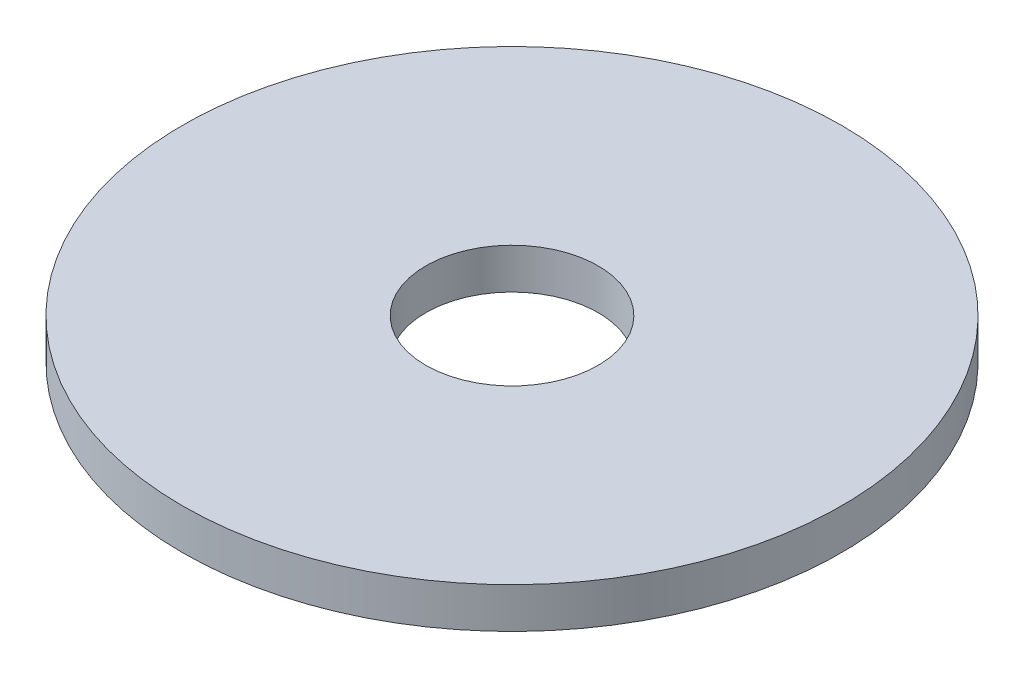
ISO-10303-21;
HEADER;
FILE_DESCRIPTION(('STEP AP214'),'2;1');
FILE_NAME('part.step','',(''),(''),'','','');
FILE_SCHEMA(('AUTOMOTIVE_DESIGN { 1 0 10303 214 1 1 1 1 }'));
ENDSEC;
DATA;
#1=APPLICATION_CONTEXT('core data for automotive mechanical design processes');
#2=APPLICATION_PROTOCOL_DEFINITION('international standard','automotive_design',2000,#1);
#3=PRODUCT_CONTEXT('',#1,'mechanical');
#4=PRODUCT('Part','Part','',(#3));
#5=PRODUCT_RELATED_PRODUCT_CATEGORY('part','',(#4));
#6=PRODUCT_DEFINITION_FORMATION('','',#4);
#7=PRODUCT_DEFINITION_CONTEXT('part definition',#1,'design');
#8=PRODUCT_DEFINITION('design','',#6,#7);
#9=PRODUCT_DEFINITION_SHAPE('','',#8);
#10=(LENGTH_UNIT() NAMED_UNIT(*) SI_UNIT(.MILLI.,.METRE.));
#11=(NAMED_UNIT(*) PLANE_ANGLE_UNIT() SI_UNIT($,.RADIAN.));
#12=(NAMED_UNIT(*) SI_UNIT($,.STERADIAN.) SOLID_ANGLE_UNIT());
#13=UNCERTAINTY_MEASURE_WITH_UNIT(LENGTH_MEASURE(1.E-05),#10,'distance_accuracy_value','');
#14=(GEOMETRIC_REPRESENTATION_CONTEXT(3) GLOBAL_UNCERTAINTY_ASSIGNED_CONTEXT((#13)) GLOBAL_UNIT_ASSIGNED_CONTEXT((#10,
#11,#12)) REPRESENTATION_CONTEXT('',''));
#15=CARTESIAN_POINT('',(0.,0.,0.));
#16=DIRECTION('',(0.,0.,1.));
#17=DIRECTION('',(1.,0.,0.));
#18=AXIS2_PLACEMENT_3D('',#15,#16,#17);
#19=CARTESIAN_POINT('',(0.,1.,0.));
#20=DIRECTION('',(0.,-1.,0.));
#21=DIRECTION('',(0.,0.,-1.));
#22=AXIS2_PLACEMENT_3D('',#19,#20,#21);
#23=CYLINDRICAL_SURFACE('',#22,8.125);
#24=CARTESIAN_POINT('',(0.,1.,0.));
#25=DIRECTION('',(0.,1.,0.));
#26=DIRECTION('',(0.,0.,1.));
#27=AXIS2_PLACEMENT_3D('',#24,#25,#26);
#28=CIRCLE('',#27,8.125);
#29=CARTESIAN_POINT('',(0.,1.,8.125));
#30=VERTEX_POINT('',#29);
#31=EDGE_CURVE('E10',#30,#30,#28,.T.);
#32=ORIENTED_EDGE('',*,*,#31,.F.);
#33=EDGE_LOOP('',(#32));
#34=FACE_BOUND('',#33,.T.);
#35=CARTESIAN_POINT('',(0.,0.,0.));
#36=DIRECTION('',(0.,1.,0.));
#37=DIRECTION('',(0.,0.,1.));
#38=AXIS2_PLACEMENT_3D('',#35,#36,#37);
#39=CIRCLE('',#38,8.125);
#40=CARTESIAN_POINT('',(0.,0.,8.125));
#41=VERTEX_POINT('',#40);
#42=EDGE_CURVE('E41',#41,#41,#39,.T.);
#43=ORIENTED_EDGE('',*,*,#42,.T.);
#44=EDGE_LOOP('',(#43));
#45=FACE_BOUND('',#44,.T.);
#46=ADVANCED_FACE('F38',(#34,#45),#23,.T.);
#47=CARTESIAN_POINT('',(0.,1.,0.));
#48=DIRECTION('',(0.,1.,0.));
#49=DIRECTION('',(0.,0.,1.));
#50=AXIS2_PLACEMENT_3D('',#47,#48,#49);
#51=PLANE('',#50);
#52=CARTESIAN_POINT('',(0.,1.,0.));
#53=DIRECTION('',(0.,1.,0.));
#54=DIRECTION('',(0.,0.,1.));
#55=AXIS2_PLACEMENT_3D('',#52,#53,#54);
#56=CIRCLE('',#55,2.125);
#57=CARTESIAN_POINT('',(0.,1.,2.125));
#58=VERTEX_POINT('',#57);
#59=EDGE_CURVE('E50',#58,#58,#56,.T.);
#60=ORIENTED_EDGE('',*,*,#59,.F.);
#61=EDGE_LOOP('',(#60));
#62=FACE_BOUND('',#61,.T.);
#63=ORIENTED_EDGE('',*,*,#31,.T.);
#64=EDGE_LOOP('',(#63));
#65=FACE_BOUND('',#64,.T.);
#66=ADVANCED_FACE('F65',(#62,#65),#51,.T.);
#67=CARTESIAN_POINT('',(0.,0.,0.));
#68=DIRECTION('',(0.,1.,0.));
#69=DIRECTION('',(0.,0.,1.));
#70=AXIS2_PLACEMENT_3D('',#67,#68,#69);
#71=PLANE('',#70);
#72=CARTESIAN_POINT('',(0.,0.,0.));
#73=DIRECTION('',(0.,1.,0.));
#74=DIRECTION('',(0.,0.,1.));
#75=AXIS2_PLACEMENT_3D('',#72,#73,#74);
#76=CIRCLE('',#75,2.125);
#77=CARTESIAN_POINT('',(0.,0.,2.125));
#78=VERTEX_POINT('',#77);
#79=EDGE_CURVE('E48',#78,#78,#76,.T.);
#80=ORIENTED_EDGE('',*,*,#79,.T.);
#81=EDGE_LOOP('',(#80));
#82=FACE_BOUND('',#81,.T.);
#83=ORIENTED_EDGE('',*,*,#42,.F.);
#84=EDGE_LOOP('',(#83));
#85=FACE_BOUND('',#84,.T.);
#86=ADVANCED_FACE('F56',(#82,#85),#71,.F.);
#87=CARTESIAN_POINT('',(0.,0.,0.));
#88=DIRECTION('',(0.,1.,0.));
#89=DIRECTION('',(0.,0.,1.));
#90=AXIS2_PLACEMENT_3D('',#87,#88,#89);
#91=CYLINDRICAL_SURFACE('',#90,2.125);
#92=ORIENTED_EDGE('',*,*,#79,.F.);
#93=EDGE_LOOP('',(#92));
#94=FACE_BOUND('',#93,.T.);
#95=ORIENTED_EDGE('',*,*,#59,.T.);
#96=EDGE_LOOP('',(#95));
#97=FACE_BOUND('',#96,.T.);
#98=ADVANCED_FACE('F59',(#94,#97),#91,.F.);
#99=CLOSED_SHELL('',(#46,#66,#86,#98));
#100=MANIFOLD_SOLID_BREP('B2',#99);
#101=ADVANCED_BREP_SHAPE_REPRESENTATION('',(#18,#100),#14);
#102=SHAPE_DEFINITION_REPRESENTATION(#9,#101);
ENDSEC;
END-ISO-10303-21;
